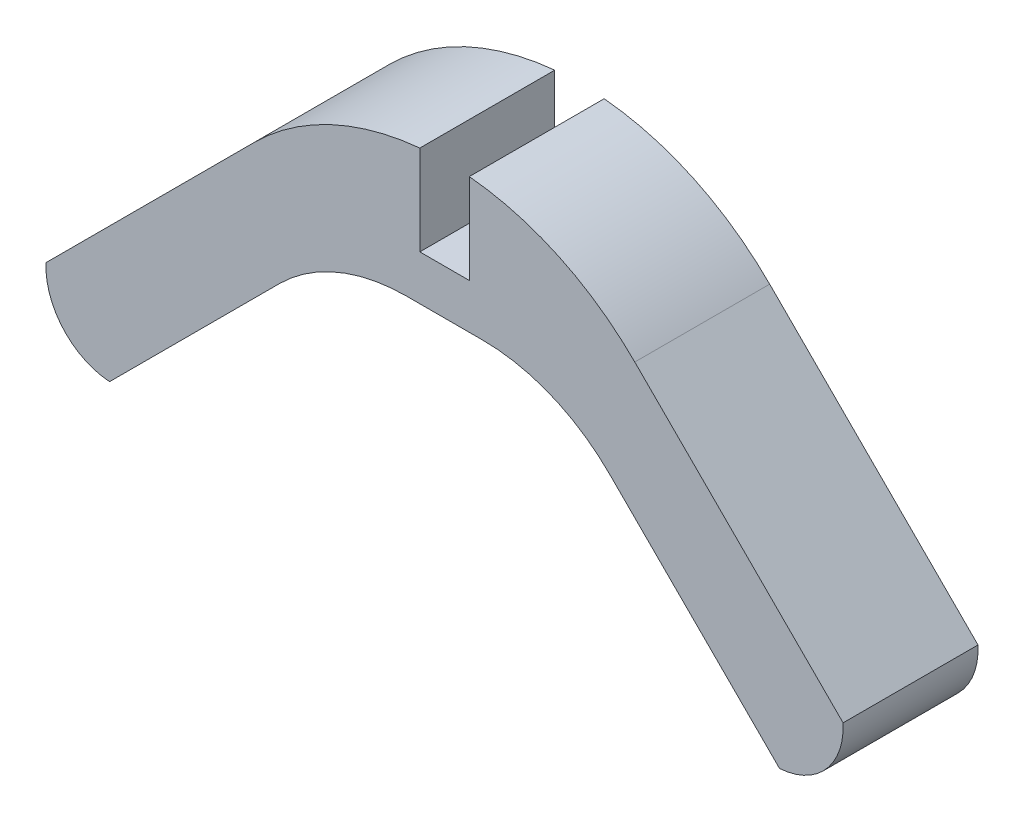
ISO-10303-21;
HEADER;
FILE_DESCRIPTION(('STEP AP214'),'2;1');
FILE_NAME('part.step','',(''),(''),'','','');
FILE_SCHEMA(('AUTOMOTIVE_DESIGN { 1 0 10303 214 1 1 1 1 }'));
ENDSEC;
DATA;
#1=APPLICATION_CONTEXT('core data for automotive mechanical design processes');
#2=APPLICATION_PROTOCOL_DEFINITION('international standard','automotive_design',2000,#1);
#3=PRODUCT_CONTEXT('',#1,'mechanical');
#4=PRODUCT('Part','Part','',(#3));
#5=PRODUCT_RELATED_PRODUCT_CATEGORY('part','',(#4));
#6=PRODUCT_DEFINITION_FORMATION('','',#4);
#7=PRODUCT_DEFINITION_CONTEXT('part definition',#1,'design');
#8=PRODUCT_DEFINITION('design','',#6,#7);
#9=PRODUCT_DEFINITION_SHAPE('','',#8);
#10=(LENGTH_UNIT() NAMED_UNIT(*) SI_UNIT(.MILLI.,.METRE.));
#11=(NAMED_UNIT(*) PLANE_ANGLE_UNIT() SI_UNIT($,.RADIAN.));
#12=(NAMED_UNIT(*) SI_UNIT($,.STERADIAN.) SOLID_ANGLE_UNIT());
#13=UNCERTAINTY_MEASURE_WITH_UNIT(LENGTH_MEASURE(1.E-05),#10,'distance_accuracy_value','');
#14=(GEOMETRIC_REPRESENTATION_CONTEXT(3) GLOBAL_UNCERTAINTY_ASSIGNED_CONTEXT((#13)) GLOBAL_UNIT_ASSIGNED_CONTEXT((#10,
#11,#12)) REPRESENTATION_CONTEXT('',''));
#15=CARTESIAN_POINT('',(0.,0.,0.));
#16=DIRECTION('',(0.,0.,1.));
#17=DIRECTION('',(1.,0.,0.));
#18=AXIS2_PLACEMENT_3D('',#15,#16,#17);
#19=CARTESIAN_POINT('',(-12.5,0.,15.));
#20=DIRECTION('',(-0.707106781186546,0.707106781186549,0.));
#21=DIRECTION('',(-0.707106781186549,-0.707106781186546,0.));
#22=AXIS2_PLACEMENT_3D('',#19,#20,#21);
#23=PLANE('',#22);
#24=DIRECTION('',(0.707106781186549,0.707106781186546,0.));
#25=VECTOR('',#24,1.);
#26=CARTESIAN_POINT('',(-12.5,0.,0.));
#27=LINE('',#26,#25);
#28=CARTESIAN_POINT('',(-37.2487373415292,-24.7487373415291,0.));
#29=VERTEX_POINT('',#28);
#30=CARTESIAN_POINT('',(-18.357864376269,-5.85786437626903,0.));
#31=VERTEX_POINT('',#30);
#32=EDGE_CURVE('E169',#29,#31,#27,.T.);
#33=ORIENTED_EDGE('',*,*,#32,.T.);
#34=DIRECTION('',(0.,0.,-1.));
#35=VECTOR('',#34,1.);
#36=CARTESIAN_POINT('',(-18.357864376269,-5.85786437626903,15.));
#37=LINE('',#36,#35);
#38=CARTESIAN_POINT('',(-18.357864376269,-5.85786437626903,15.));
#39=VERTEX_POINT('',#38);
#40=EDGE_CURVE('E228',#31,#39,#37,.F.);
#41=ORIENTED_EDGE('',*,*,#40,.T.);
#42=DIRECTION('',(0.707106781186549,0.707106781186546,0.));
#43=VECTOR('',#42,1.);
#44=CARTESIAN_POINT('',(-12.5,0.,15.));
#45=LINE('',#44,#43);
#46=CARTESIAN_POINT('',(-37.2487373415292,-24.7487373415291,15.));
#47=VERTEX_POINT('',#46);
#48=EDGE_CURVE('E192',#47,#39,#45,.T.);
#49=ORIENTED_EDGE('',*,*,#48,.F.);
#50=DIRECTION('',(0.,0.,-1.));
#51=VECTOR('',#50,1.);
#52=CARTESIAN_POINT('',(-37.2487373415292,-24.7487373415291,15.));
#53=LINE('',#52,#51);
#54=EDGE_CURVE('E168',#47,#29,#53,.T.);
#55=ORIENTED_EDGE('',*,*,#54,.T.);
#56=EDGE_LOOP('',(#33,#41,#49,#55));
#57=FACE_BOUND('',#56,.T.);
#58=ADVANCED_FACE('F33',(#57),#23,.F.);
#59=CARTESIAN_POINT('',(12.5,0.,15.));
#60=DIRECTION('',(0.,1.,0.));
#61=DIRECTION('',(0.,0.,1.));
#62=AXIS2_PLACEMENT_3D('',#59,#60,#61);
#63=PLANE('',#62);
#64=DIRECTION('',(1.,0.,0.));
#65=VECTOR('',#64,1.);
#66=CARTESIAN_POINT('',(12.5,0.,15.));
#67=LINE('',#66,#65);
#68=CARTESIAN_POINT('',(-4.21572875253812,0.,15.));
#69=VERTEX_POINT('',#68);
#70=CARTESIAN_POINT('',(4.21572875253812,0.,15.));
#71=VERTEX_POINT('',#70);
#72=EDGE_CURVE('E138',#69,#71,#67,.T.);
#73=ORIENTED_EDGE('',*,*,#72,.F.);
#74=DIRECTION('',(0.,0.,-1.));
#75=VECTOR('',#74,1.);
#76=CARTESIAN_POINT('',(-4.21572875253812,0.,0.));
#77=LINE('',#76,#75);
#78=CARTESIAN_POINT('',(-4.21572875253812,0.,0.));
#79=VERTEX_POINT('',#78);
#80=EDGE_CURVE('E225',#69,#79,#77,.T.);
#81=ORIENTED_EDGE('',*,*,#80,.T.);
#82=DIRECTION('',(1.,0.,0.));
#83=VECTOR('',#82,1.);
#84=CARTESIAN_POINT('',(12.5,0.,0.));
#85=LINE('',#84,#83);
#86=CARTESIAN_POINT('',(4.21572875253812,0.,0.));
#87=VERTEX_POINT('',#86);
#88=EDGE_CURVE('E172',#79,#87,#85,.T.);
#89=ORIENTED_EDGE('',*,*,#88,.T.);
#90=DIRECTION('',(0.,0.,-1.));
#91=VECTOR('',#90,1.);
#92=CARTESIAN_POINT('',(4.21572875253812,0.,15.));
#93=LINE('',#92,#91);
#94=EDGE_CURVE('E223',#87,#71,#93,.F.);
#95=ORIENTED_EDGE('',*,*,#94,.T.);
#96=EDGE_LOOP('',(#73,#81,#89,#95));
#97=FACE_BOUND('',#96,.T.);
#98=ADVANCED_FACE('F241',(#97),#63,.F.);
#99=CARTESIAN_POINT('',(12.5,0.,15.));
#100=DIRECTION('',(0.707106781186546,0.707106781186549,0.));
#101=DIRECTION('',(-0.707106781186549,0.707106781186546,0.));
#102=AXIS2_PLACEMENT_3D('',#99,#100,#101);
#103=PLANE('',#102);
#104=DIRECTION('',(0.707106781186549,-0.707106781186546,0.));
#105=VECTOR('',#104,1.);
#106=CARTESIAN_POINT('',(12.5,0.,15.));
#107=LINE('',#106,#105);
#108=CARTESIAN_POINT('',(18.357864376269,-5.85786437626903,15.));
#109=VERTEX_POINT('',#108);
#110=CARTESIAN_POINT('',(37.2487373415292,-24.7487373415291,15.));
#111=VERTEX_POINT('',#110);
#112=EDGE_CURVE('E130',#109,#111,#107,.T.);
#113=ORIENTED_EDGE('',*,*,#112,.F.);
#114=DIRECTION('',(0.,0.,-1.));
#115=VECTOR('',#114,1.);
#116=CARTESIAN_POINT('',(18.357864376269,-5.85786437626903,0.));
#117=LINE('',#116,#115);
#118=CARTESIAN_POINT('',(18.357864376269,-5.85786437626903,0.));
#119=VERTEX_POINT('',#118);
#120=EDGE_CURVE('E230',#109,#119,#117,.T.);
#121=ORIENTED_EDGE('',*,*,#120,.T.);
#122=DIRECTION('',(0.707106781186549,-0.707106781186546,0.));
#123=VECTOR('',#122,1.);
#124=CARTESIAN_POINT('',(12.5,0.,0.));
#125=LINE('',#124,#123);
#126=CARTESIAN_POINT('',(37.2487373415292,-24.7487373415291,0.));
#127=VERTEX_POINT('',#126);
#128=EDGE_CURVE('E144',#119,#127,#125,.T.);
#129=ORIENTED_EDGE('',*,*,#128,.T.);
#130=DIRECTION('',(0.,0.,-1.));
#131=VECTOR('',#130,1.);
#132=CARTESIAN_POINT('',(37.2487373415292,-24.7487373415291,15.));
#133=LINE('',#132,#131);
#134=EDGE_CURVE('E141',#111,#127,#133,.T.);
#135=ORIENTED_EDGE('',*,*,#134,.F.);
#136=EDGE_LOOP('',(#113,#121,#129,#135));
#137=FACE_BOUND('',#136,.T.);
#138=ADVANCED_FACE('F142',(#137),#103,.F.);
#139=CARTESIAN_POINT('',(36.7643470816214,-17.1992795107747,15.));
#140=DIRECTION('',(0.,0.,-1.));
#141=DIRECTION('',(-1.,0.,0.));
#142=AXIS2_PLACEMENT_3D('',#139,#140,#141);
#143=CYLINDRICAL_SURFACE('',#142,7.56498165643726);
#144=CARTESIAN_POINT('',(36.7643470816214,-17.1992795107747,0.));
#145=DIRECTION('',(0.,0.,1.));
#146=DIRECTION('',(1.,0.,0.));
#147=AXIS2_PLACEMENT_3D('',#144,#145,#146);
#148=CIRCLE('',#147,7.56498165643726);
#149=CARTESIAN_POINT('',(44.3198051533947,-16.8198051533946,0.));
#150=VERTEX_POINT('',#149);
#151=EDGE_CURVE('E176',#127,#150,#148,.T.);
#152=ORIENTED_EDGE('',*,*,#151,.T.);
#153=DIRECTION('',(0.,0.,-1.));
#154=VECTOR('',#153,1.);
#155=CARTESIAN_POINT('',(44.3198051533947,-16.8198051533946,15.));
#156=LINE('',#155,#154);
#157=CARTESIAN_POINT('',(44.3198051533947,-16.8198051533946,15.));
#158=VERTEX_POINT('',#157);
#159=EDGE_CURVE('E148',#158,#150,#156,.T.);
#160=ORIENTED_EDGE('',*,*,#159,.F.);
#161=CARTESIAN_POINT('',(36.7643470816214,-17.1992795107747,15.));
#162=DIRECTION('',(0.,0.,1.));
#163=DIRECTION('',(1.,0.,0.));
#164=AXIS2_PLACEMENT_3D('',#161,#162,#163);
#165=CIRCLE('',#164,7.56498165643726);
#166=EDGE_CURVE('E135',#111,#158,#165,.T.);
#167=ORIENTED_EDGE('',*,*,#166,.F.);
#168=ORIENTED_EDGE('',*,*,#134,.T.);
#169=EDGE_LOOP('',(#152,#160,#167,#168));
#170=FACE_BOUND('',#169,.T.);
#171=ADVANCED_FACE('F150',(#170),#143,.T.);
#172=CARTESIAN_POINT('',(44.3198051533947,-16.8198051533946,15.));
#173=DIRECTION('',(-0.707106781186547,-0.707106781186548,0.));
#174=DIRECTION('',(0.707106781186548,-0.707106781186547,0.));
#175=AXIS2_PLACEMENT_3D('',#172,#173,#174);
#176=PLANE('',#175);
#177=DIRECTION('',(-0.707106781186548,0.707106781186547,0.));
#178=VECTOR('',#177,1.);
#179=CARTESIAN_POINT('',(44.3198051533947,-16.8198051533946,0.));
#180=LINE('',#179,#178);
#181=CARTESIAN_POINT('',(21.1550816145752,6.34491838542485,0.));
#182=VERTEX_POINT('',#181);
#183=EDGE_CURVE('E178',#150,#182,#180,.T.);
#184=ORIENTED_EDGE('',*,*,#183,.T.);
#185=DIRECTION('',(0.,0.,1.));
#186=VECTOR('',#185,1.);
#187=CARTESIAN_POINT('',(21.1550816145752,6.34491838542485,15.));
#188=LINE('',#187,#186);
#189=CARTESIAN_POINT('',(21.1550816145752,6.34491838542485,15.));
#190=VERTEX_POINT('',#189);
#191=EDGE_CURVE('E214',#182,#190,#188,.T.);
#192=ORIENTED_EDGE('',*,*,#191,.T.);
#193=DIRECTION('',(-0.707106781186548,0.707106781186547,0.));
#194=VECTOR('',#193,1.);
#195=CARTESIAN_POINT('',(44.3198051533947,-16.8198051533946,15.));
#196=LINE('',#195,#194);
#197=EDGE_CURVE('E153',#158,#190,#196,.T.);
#198=ORIENTED_EDGE('',*,*,#197,.F.);
#199=ORIENTED_EDGE('',*,*,#159,.T.);
#200=EDGE_LOOP('',(#184,#192,#198,#199));
#201=FACE_BOUND('',#200,.T.);
#202=ADVANCED_FACE('F304',(#201),#176,.F.);
#203=CARTESIAN_POINT('',(2.75,15.,15.));
#204=DIRECTION('',(1.,0.,0.));
#205=DIRECTION('',(0.,1.,0.));
#206=AXIS2_PLACEMENT_3D('',#203,#204,#205);
#207=PLANE('',#206);
#208=DIRECTION('',(0.,-1.,0.));
#209=VECTOR('',#208,1.);
#210=CARTESIAN_POINT('',(2.75,15.,0.));
#211=LINE('',#210,#209);
#212=CARTESIAN_POINT('',(2.75,15.,0.));
#213=VERTEX_POINT('',#212);
#214=CARTESIAN_POINT('',(2.75,5.00000000000001,0.));
#215=VERTEX_POINT('',#214);
#216=EDGE_CURVE('E181',#213,#215,#211,.T.);
#217=ORIENTED_EDGE('',*,*,#216,.T.);
#218=DIRECTION('',(0.,0.,-1.));
#219=VECTOR('',#218,1.);
#220=CARTESIAN_POINT('',(2.75,5.00000000000001,15.));
#221=LINE('',#220,#219);
#222=CARTESIAN_POINT('',(2.75,5.00000000000001,15.));
#223=VERTEX_POINT('',#222);
#224=EDGE_CURVE('E204',#223,#215,#221,.T.);
#225=ORIENTED_EDGE('',*,*,#224,.F.);
#226=DIRECTION('',(0.,-1.,0.));
#227=VECTOR('',#226,1.);
#228=CARTESIAN_POINT('',(2.75,15.,15.));
#229=LINE('',#228,#227);
#230=CARTESIAN_POINT('',(2.75,15.,15.));
#231=VERTEX_POINT('',#230);
#232=EDGE_CURVE('E155',#231,#223,#229,.T.);
#233=ORIENTED_EDGE('',*,*,#232,.F.);
#234=DIRECTION('',(0.,0.,-1.));
#235=VECTOR('',#234,1.);
#236=CARTESIAN_POINT('',(2.75,15.,15.));
#237=LINE('',#236,#235);
#238=EDGE_CURVE('E207',#231,#213,#237,.T.);
#239=ORIENTED_EDGE('',*,*,#238,.T.);
#240=EDGE_LOOP('',(#217,#225,#233,#239));
#241=FACE_BOUND('',#240,.T.);
#242=ADVANCED_FACE('F298',(#241),#207,.F.);
#243=CARTESIAN_POINT('',(-2.75,5.00000000000001,15.));
#244=DIRECTION('',(0.,-1.,0.));
#245=DIRECTION('',(1.,0.,0.));
#246=AXIS2_PLACEMENT_3D('',#243,#244,#245);
#247=PLANE('',#246);
#248=DIRECTION('',(-1.,0.,0.));
#249=VECTOR('',#248,1.);
#250=CARTESIAN_POINT('',(-2.75,5.00000000000001,0.));
#251=LINE('',#250,#249);
#252=CARTESIAN_POINT('',(-2.75,5.00000000000001,0.));
#253=VERTEX_POINT('',#252);
#254=EDGE_CURVE('E183',#215,#253,#251,.T.);
#255=ORIENTED_EDGE('',*,*,#254,.T.);
#256=DIRECTION('',(0.,0.,-1.));
#257=VECTOR('',#256,1.);
#258=CARTESIAN_POINT('',(-2.75,5.00000000000001,15.));
#259=LINE('',#258,#257);
#260=CARTESIAN_POINT('',(-2.75,5.00000000000001,15.));
#261=VERTEX_POINT('',#260);
#262=EDGE_CURVE('E201',#261,#253,#259,.T.);
#263=ORIENTED_EDGE('',*,*,#262,.F.);
#264=DIRECTION('',(-1.,0.,0.));
#265=VECTOR('',#264,1.);
#266=CARTESIAN_POINT('',(-2.75,5.00000000000001,15.));
#267=LINE('',#266,#265);
#268=EDGE_CURVE('E160',#223,#261,#267,.T.);
#269=ORIENTED_EDGE('',*,*,#268,.F.);
#270=ORIENTED_EDGE('',*,*,#224,.T.);
#271=EDGE_LOOP('',(#255,#263,#269,#270));
#272=FACE_BOUND('',#271,.T.);
#273=ADVANCED_FACE('F294',(#272),#247,.F.);
#274=CARTESIAN_POINT('',(-2.75,15.,15.));
#275=DIRECTION('',(-1.,0.,0.));
#276=DIRECTION('',(0.,-1.,0.));
#277=AXIS2_PLACEMENT_3D('',#274,#275,#276);
#278=PLANE('',#277);
#279=DIRECTION('',(0.,1.,0.));
#280=VECTOR('',#279,1.);
#281=CARTESIAN_POINT('',(-2.75,15.,0.));
#282=LINE('',#281,#280);
#283=CARTESIAN_POINT('',(-2.75,15.,0.));
#284=VERTEX_POINT('',#283);
#285=EDGE_CURVE('E185',#253,#284,#282,.T.);
#286=ORIENTED_EDGE('',*,*,#285,.T.);
#287=DIRECTION('',(0.,0.,-1.));
#288=VECTOR('',#287,1.);
#289=CARTESIAN_POINT('',(-2.75,15.,15.));
#290=LINE('',#289,#288);
#291=CARTESIAN_POINT('',(-2.75,15.,15.));
#292=VERTEX_POINT('',#291);
#293=EDGE_CURVE('E198',#292,#284,#290,.T.);
#294=ORIENTED_EDGE('',*,*,#293,.F.);
#295=DIRECTION('',(0.,1.,0.));
#296=VECTOR('',#295,1.);
#297=CARTESIAN_POINT('',(-2.75,15.,15.));
#298=LINE('',#297,#296);
#299=EDGE_CURVE('E162',#261,#292,#298,.T.);
#300=ORIENTED_EDGE('',*,*,#299,.F.);
#301=ORIENTED_EDGE('',*,*,#262,.T.);
#302=EDGE_LOOP('',(#286,#294,#300,#301));
#303=FACE_BOUND('',#302,.T.);
#304=ADVANCED_FACE('F290',(#303),#278,.F.);
#305=CARTESIAN_POINT('',(-44.3198051533947,-16.8198051533946,15.));
#306=DIRECTION('',(0.707106781186547,-0.707106781186548,0.));
#307=DIRECTION('',(0.707106781186548,0.707106781186547,0.));
#308=AXIS2_PLACEMENT_3D('',#305,#306,#307);
#309=PLANE('',#308);
#310=DIRECTION('',(-0.707106781186548,-0.707106781186547,0.));
#311=VECTOR('',#310,1.);
#312=CARTESIAN_POINT('',(-44.3198051533947,-16.8198051533946,15.));
#313=LINE('',#312,#311);
#314=CARTESIAN_POINT('',(-21.1550816145752,6.34491838542485,15.));
#315=VERTEX_POINT('',#314);
#316=CARTESIAN_POINT('',(-44.3198051533947,-16.8198051533946,15.));
#317=VERTEX_POINT('',#316);
#318=EDGE_CURVE('E164',#315,#317,#313,.T.);
#319=ORIENTED_EDGE('',*,*,#318,.F.);
#320=DIRECTION('',(0.,0.,-1.));
#321=VECTOR('',#320,1.);
#322=CARTESIAN_POINT('',(-21.1550816145752,6.34491838542485,15.));
#323=LINE('',#322,#321);
#324=CARTESIAN_POINT('',(-21.1550816145752,6.34491838542485,0.));
#325=VERTEX_POINT('',#324);
#326=EDGE_CURVE('E220',#315,#325,#323,.T.);
#327=ORIENTED_EDGE('',*,*,#326,.T.);
#328=DIRECTION('',(-0.707106781186548,-0.707106781186547,0.));
#329=VECTOR('',#328,1.);
#330=CARTESIAN_POINT('',(-44.3198051533947,-16.8198051533946,0.));
#331=LINE('',#330,#329);
#332=CARTESIAN_POINT('',(-44.3198051533947,-16.8198051533946,0.));
#333=VERTEX_POINT('',#332);
#334=EDGE_CURVE('E188',#325,#333,#331,.T.);
#335=ORIENTED_EDGE('',*,*,#334,.T.);
#336=DIRECTION('',(0.,0.,-1.));
#337=VECTOR('',#336,1.);
#338=CARTESIAN_POINT('',(-44.3198051533947,-16.8198051533946,15.));
#339=LINE('',#338,#337);
#340=EDGE_CURVE('E195',#317,#333,#339,.T.);
#341=ORIENTED_EDGE('',*,*,#340,.F.);
#342=EDGE_LOOP('',(#319,#327,#335,#341));
#343=FACE_BOUND('',#342,.T.);
#344=ADVANCED_FACE('F274',(#343),#309,.F.);
#345=CARTESIAN_POINT('',(-36.7643470816214,-17.1992795107747,15.));
#346=DIRECTION('',(0.,0.,-1.));
#347=DIRECTION('',(-1.,0.,0.));
#348=AXIS2_PLACEMENT_3D('',#345,#346,#347);
#349=CYLINDRICAL_SURFACE('',#348,7.56498165643726);
#350=CARTESIAN_POINT('',(-36.7643470816214,-17.1992795107747,0.));
#351=DIRECTION('',(0.,0.,1.));
#352=DIRECTION('',(-1.,0.,0.));
#353=AXIS2_PLACEMENT_3D('',#350,#351,#352);
#354=CIRCLE('',#353,7.56498165643726);
#355=EDGE_CURVE('E190',#333,#29,#354,.T.);
#356=ORIENTED_EDGE('',*,*,#355,.T.);
#357=ORIENTED_EDGE('',*,*,#54,.F.);
#358=CARTESIAN_POINT('',(-36.7643470816214,-17.1992795107747,15.));
#359=DIRECTION('',(0.,0.,1.));
#360=DIRECTION('',(-1.,0.,0.));
#361=AXIS2_PLACEMENT_3D('',#358,#359,#360);
#362=CIRCLE('',#361,7.56498165643726);
#363=EDGE_CURVE('E166',#317,#47,#362,.T.);
#364=ORIENTED_EDGE('',*,*,#363,.F.);
#365=ORIENTED_EDGE('',*,*,#340,.T.);
#366=EDGE_LOOP('',(#356,#357,#364,#365));
#367=FACE_BOUND('',#366,.T.);
#368=ADVANCED_FACE('F280',(#367),#349,.T.);
#369=CARTESIAN_POINT('',(-36.7643470816214,-17.1992795107747,15.));
#370=DIRECTION('',(0.,0.,-1.));
#371=DIRECTION('',(-1.,0.,0.));
#372=AXIS2_PLACEMENT_3D('',#369,#370,#371);
#373=PLANE('',#372);
#374=ORIENTED_EDGE('',*,*,#197,.T.);
#375=CARTESIAN_POINT('',(-0.0581218210212193,-14.8682850501716,15.));
#376=DIRECTION('',(0.,0.,-1.));
#377=DIRECTION('',(-1.,0.,0.));
#378=AXIS2_PLACEMENT_3D('',#375,#376,#377);
#379=CIRCLE('',#378,30.);
#380=EDGE_CURVE('E218',#190,#231,#379,.F.);
#381=ORIENTED_EDGE('',*,*,#380,.T.);
#382=ORIENTED_EDGE('',*,*,#232,.T.);
#383=ORIENTED_EDGE('',*,*,#268,.T.);
#384=ORIENTED_EDGE('',*,*,#299,.T.);
#385=CARTESIAN_POINT('',(0.0581218210212193,-14.8682850501716,15.));
#386=DIRECTION('',(0.,0.,-1.));
#387=DIRECTION('',(-1.,0.,0.));
#388=AXIS2_PLACEMENT_3D('',#385,#386,#387);
#389=CIRCLE('',#388,30.);
#390=EDGE_CURVE('E216',#292,#315,#389,.F.);
#391=ORIENTED_EDGE('',*,*,#390,.T.);
#392=ORIENTED_EDGE('',*,*,#318,.T.);
#393=ORIENTED_EDGE('',*,*,#363,.T.);
#394=ORIENTED_EDGE('',*,*,#48,.T.);
#395=CARTESIAN_POINT('',(-4.21572875253812,-20.,15.));
#396=DIRECTION('',(0.,0.,-1.));
#397=DIRECTION('',(-1.,0.,0.));
#398=AXIS2_PLACEMENT_3D('',#395,#396,#397);
#399=CIRCLE('',#398,20.);
#400=EDGE_CURVE('E234',#39,#69,#399,.T.);
#401=ORIENTED_EDGE('',*,*,#400,.T.);
#402=ORIENTED_EDGE('',*,*,#72,.T.);
#403=CARTESIAN_POINT('',(4.21572875253812,-20.,15.));
#404=DIRECTION('',(0.,0.,-1.));
#405=DIRECTION('',(-1.,0.,0.));
#406=AXIS2_PLACEMENT_3D('',#403,#404,#405);
#407=CIRCLE('',#406,20.);
#408=EDGE_CURVE('E11',#71,#109,#407,.T.);
#409=ORIENTED_EDGE('',*,*,#408,.T.);
#410=ORIENTED_EDGE('',*,*,#112,.T.);
#411=ORIENTED_EDGE('',*,*,#166,.T.);
#412=EDGE_LOOP('',(#374,#381,#382,#383,#384,#391,#392,#393,#394,#401,#402,#409,#410,#411));
#413=FACE_BOUND('',#412,.T.);
#414=ADVANCED_FACE('F133',(#413),#373,.F.);
#415=CARTESIAN_POINT('',(-36.7643470816214,-17.1992795107747,0.));
#416=DIRECTION('',(0.,0.,-1.));
#417=DIRECTION('',(-1.,0.,0.));
#418=AXIS2_PLACEMENT_3D('',#415,#416,#417);
#419=PLANE('',#418);
#420=ORIENTED_EDGE('',*,*,#216,.F.);
#421=CARTESIAN_POINT('',(-0.0581218210212193,-14.8682850501716,0.));
#422=DIRECTION('',(0.,0.,-1.));
#423=DIRECTION('',(-1.,0.,0.));
#424=AXIS2_PLACEMENT_3D('',#421,#422,#423);
#425=CIRCLE('',#424,30.);
#426=EDGE_CURVE('E212',#213,#182,#425,.T.);
#427=ORIENTED_EDGE('',*,*,#426,.T.);
#428=ORIENTED_EDGE('',*,*,#183,.F.);
#429=ORIENTED_EDGE('',*,*,#151,.F.);
#430=ORIENTED_EDGE('',*,*,#128,.F.);
#431=CARTESIAN_POINT('',(4.21572875253812,-20.,0.));
#432=DIRECTION('',(0.,0.,-1.));
#433=DIRECTION('',(-1.,0.,0.));
#434=AXIS2_PLACEMENT_3D('',#431,#432,#433);
#435=CIRCLE('',#434,20.);
#436=EDGE_CURVE('E41',#119,#87,#435,.F.);
#437=ORIENTED_EDGE('',*,*,#436,.T.);
#438=ORIENTED_EDGE('',*,*,#88,.F.);
#439=CARTESIAN_POINT('',(-4.21572875253812,-20.,0.));
#440=DIRECTION('',(0.,0.,-1.));
#441=DIRECTION('',(-1.,0.,0.));
#442=AXIS2_PLACEMENT_3D('',#439,#440,#441);
#443=CIRCLE('',#442,20.);
#444=EDGE_CURVE('E232',#79,#31,#443,.F.);
#445=ORIENTED_EDGE('',*,*,#444,.T.);
#446=ORIENTED_EDGE('',*,*,#32,.F.);
#447=ORIENTED_EDGE('',*,*,#355,.F.);
#448=ORIENTED_EDGE('',*,*,#334,.F.);
#449=CARTESIAN_POINT('',(0.0581218210212193,-14.8682850501716,0.));
#450=DIRECTION('',(0.,0.,-1.));
#451=DIRECTION('',(-1.,0.,0.));
#452=AXIS2_PLACEMENT_3D('',#449,#450,#451);
#453=CIRCLE('',#452,30.);
#454=EDGE_CURVE('E147',#325,#284,#453,.T.);
#455=ORIENTED_EDGE('',*,*,#454,.T.);
#456=ORIENTED_EDGE('',*,*,#285,.F.);
#457=ORIENTED_EDGE('',*,*,#254,.F.);
#458=EDGE_LOOP('',(#420,#427,#428,#429,#430,#437,#438,#445,#446,#447,#448,#455,#456,#457));
#459=FACE_BOUND('',#458,.T.);
#460=ADVANCED_FACE('F238',(#459),#419,.T.);
#461=CARTESIAN_POINT('',(-0.0581218210212193,-14.8682850501716,15.));
#462=DIRECTION('',(0.,0.,1.));
#463=DIRECTION('',(1.,0.,0.));
#464=AXIS2_PLACEMENT_3D('',#461,#462,#463);
#465=CYLINDRICAL_SURFACE('',#464,30.);
#466=ORIENTED_EDGE('',*,*,#380,.F.);
#467=ORIENTED_EDGE('',*,*,#191,.F.);
#468=ORIENTED_EDGE('',*,*,#426,.F.);
#469=ORIENTED_EDGE('',*,*,#238,.F.);
#470=EDGE_LOOP('',(#466,#467,#468,#469));
#471=FACE_BOUND('',#470,.T.);
#472=ADVANCED_FACE('F259',(#471),#465,.T.);
#473=CARTESIAN_POINT('',(0.0581218210212193,-14.8682850501716,15.));
#474=DIRECTION('',(0.,0.,-1.));
#475=DIRECTION('',(-1.,0.,0.));
#476=AXIS2_PLACEMENT_3D('',#473,#474,#475);
#477=CYLINDRICAL_SURFACE('',#476,30.);
#478=ORIENTED_EDGE('',*,*,#390,.F.);
#479=ORIENTED_EDGE('',*,*,#293,.T.);
#480=ORIENTED_EDGE('',*,*,#454,.F.);
#481=ORIENTED_EDGE('',*,*,#326,.F.);
#482=EDGE_LOOP('',(#478,#479,#480,#481));
#483=FACE_BOUND('',#482,.T.);
#484=ADVANCED_FACE('F248',(#483),#477,.T.);
#485=CARTESIAN_POINT('',(-4.21572875253812,-20.,15.));
#486=DIRECTION('',(0.,0.,1.));
#487=DIRECTION('',(1.,0.,0.));
#488=AXIS2_PLACEMENT_3D('',#485,#486,#487);
#489=CYLINDRICAL_SURFACE('',#488,20.);
#490=ORIENTED_EDGE('',*,*,#400,.F.);
#491=ORIENTED_EDGE('',*,*,#40,.F.);
#492=ORIENTED_EDGE('',*,*,#444,.F.);
#493=ORIENTED_EDGE('',*,*,#80,.F.);
#494=EDGE_LOOP('',(#490,#491,#492,#493));
#495=FACE_BOUND('',#494,.T.);
#496=ADVANCED_FACE('F244',(#495),#489,.F.);
#497=CARTESIAN_POINT('',(4.21572875253812,-20.,15.));
#498=DIRECTION('',(0.,0.,1.));
#499=DIRECTION('',(1.,0.,0.));
#500=AXIS2_PLACEMENT_3D('',#497,#498,#499);
#501=CYLINDRICAL_SURFACE('',#500,20.);
#502=ORIENTED_EDGE('',*,*,#408,.F.);
#503=ORIENTED_EDGE('',*,*,#94,.F.);
#504=ORIENTED_EDGE('',*,*,#436,.F.);
#505=ORIENTED_EDGE('',*,*,#120,.F.);
#506=EDGE_LOOP('',(#502,#503,#504,#505));
#507=FACE_BOUND('',#506,.T.);
#508=ADVANCED_FACE('F35',(#507),#501,.F.);
#509=CLOSED_SHELL('',(#58,#98,#138,#171,#202,#242,#273,#304,#344,#368,#414,#460,#472,#484,#496,#508));
#510=MANIFOLD_SOLID_BREP('B2',#509);
#511=ADVANCED_BREP_SHAPE_REPRESENTATION('',(#18,#510),#14);
#512=SHAPE_DEFINITION_REPRESENTATION(#9,#511);
ENDSEC;
END-ISO-10303-21;
